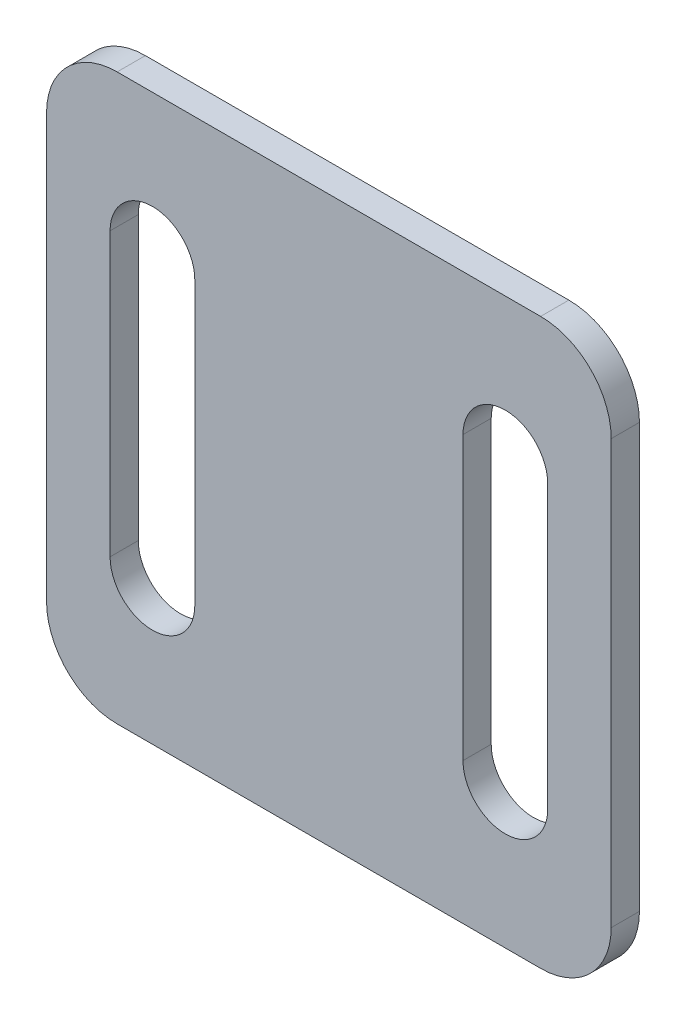
ISO-10303-21;
HEADER;
FILE_DESCRIPTION(('STEP AP214'),'2;1');
FILE_NAME('part.step','',(''),(''),'','','');
FILE_SCHEMA(('AUTOMOTIVE_DESIGN { 1 0 10303 214 1 1 1 1 }'));
ENDSEC;
DATA;
#1=APPLICATION_CONTEXT('core data for automotive mechanical design processes');
#2=APPLICATION_PROTOCOL_DEFINITION('international standard','automotive_design',2000,#1);
#3=PRODUCT_CONTEXT('',#1,'mechanical');
#4=PRODUCT('Part','Part','',(#3));
#5=PRODUCT_RELATED_PRODUCT_CATEGORY('part','',(#4));
#6=PRODUCT_DEFINITION_FORMATION('','',#4);
#7=PRODUCT_DEFINITION_CONTEXT('part definition',#1,'design');
#8=PRODUCT_DEFINITION('design','',#6,#7);
#9=PRODUCT_DEFINITION_SHAPE('','',#8);
#10=(LENGTH_UNIT() NAMED_UNIT(*) SI_UNIT(.MILLI.,.METRE.));
#11=(NAMED_UNIT(*) PLANE_ANGLE_UNIT() SI_UNIT($,.RADIAN.));
#12=(NAMED_UNIT(*) SI_UNIT($,.STERADIAN.) SOLID_ANGLE_UNIT());
#13=UNCERTAINTY_MEASURE_WITH_UNIT(LENGTH_MEASURE(1.E-05),#10,'distance_accuracy_value','');
#14=(GEOMETRIC_REPRESENTATION_CONTEXT(3) GLOBAL_UNCERTAINTY_ASSIGNED_CONTEXT((#13)) GLOBAL_UNIT_ASSIGNED_CONTEXT((#10,
#11,#12)) REPRESENTATION_CONTEXT('',''));
#15=CARTESIAN_POINT('',(0.,0.,0.));
#16=DIRECTION('',(0.,0.,1.));
#17=DIRECTION('',(1.,0.,0.));
#18=AXIS2_PLACEMENT_3D('',#15,#16,#17);
#19=CARTESIAN_POINT('',(0.,0.,4.));
#20=DIRECTION('',(0.,0.,-1.));
#21=DIRECTION('',(-1.,0.,0.));
#22=AXIS2_PLACEMENT_3D('',#19,#20,#21);
#23=PLANE('',#22);
#24=CARTESIAN_POINT('',(25.,-20.,4.));
#25=DIRECTION('',(0.,0.,1.));
#26=DIRECTION('',(1.,0.,0.));
#27=AXIS2_PLACEMENT_3D('',#24,#25,#26);
#28=CIRCLE('',#27,6.);
#29=CARTESIAN_POINT('',(19.,-20.,4.));
#30=VERTEX_POINT('',#29);
#31=CARTESIAN_POINT('',(31.,-20.,4.));
#32=VERTEX_POINT('',#31);
#33=EDGE_CURVE('E197',#30,#32,#28,.T.);
#34=ORIENTED_EDGE('',*,*,#33,.F.);
#35=DIRECTION('',(0.,-1.,0.));
#36=VECTOR('',#35,1.);
#37=CARTESIAN_POINT('',(19.,-20.,4.));
#38=LINE('',#37,#36);
#39=CARTESIAN_POINT('',(19.,20.,4.));
#40=VERTEX_POINT('',#39);
#41=EDGE_CURVE('E205',#40,#30,#38,.T.);
#42=ORIENTED_EDGE('',*,*,#41,.F.);
#43=CARTESIAN_POINT('',(25.,20.,4.));
#44=DIRECTION('',(0.,0.,1.));
#45=DIRECTION('',(1.,0.,0.));
#46=AXIS2_PLACEMENT_3D('',#43,#44,#45);
#47=CIRCLE('',#46,6.);
#48=CARTESIAN_POINT('',(31.,20.,4.));
#49=VERTEX_POINT('',#48);
#50=EDGE_CURVE('E202',#49,#40,#47,.T.);
#51=ORIENTED_EDGE('',*,*,#50,.F.);
#52=DIRECTION('',(0.,1.,0.));
#53=VECTOR('',#52,1.);
#54=CARTESIAN_POINT('',(31.,-20.,4.));
#55=LINE('',#54,#53);
#56=EDGE_CURVE('E199',#32,#49,#55,.T.);
#57=ORIENTED_EDGE('',*,*,#56,.F.);
#58=EDGE_LOOP('',(#34,#42,#51,#57));
#59=FACE_BOUND('',#58,.T.);
#60=DIRECTION('',(0.,1.,0.));
#61=VECTOR('',#60,1.);
#62=CARTESIAN_POINT('',(40.,-40.,4.));
#63=LINE('',#62,#61);
#64=CARTESIAN_POINT('',(40.,-30.,4.));
#65=VERTEX_POINT('',#64);
#66=CARTESIAN_POINT('',(40.,30.,4.));
#67=VERTEX_POINT('',#66);
#68=EDGE_CURVE('E228',#65,#67,#63,.T.);
#69=ORIENTED_EDGE('',*,*,#68,.T.);
#70=CARTESIAN_POINT('',(30.,30.,4.));
#71=DIRECTION('',(0.,0.,-1.));
#72=DIRECTION('',(-1.,0.,0.));
#73=AXIS2_PLACEMENT_3D('',#70,#71,#72);
#74=CIRCLE('',#73,10.);
#75=CARTESIAN_POINT('',(30.,40.,4.));
#76=VERTEX_POINT('',#75);
#77=EDGE_CURVE('E271',#67,#76,#74,.F.);
#78=ORIENTED_EDGE('',*,*,#77,.T.);
#79=DIRECTION('',(-1.,0.,0.));
#80=VECTOR('',#79,1.);
#81=CARTESIAN_POINT('',(-40.,40.,4.));
#82=LINE('',#81,#80);
#83=CARTESIAN_POINT('',(-30.,40.,4.));
#84=VERTEX_POINT('',#83);
#85=EDGE_CURVE('E231',#76,#84,#82,.T.);
#86=ORIENTED_EDGE('',*,*,#85,.T.);
#87=CARTESIAN_POINT('',(-30.,30.,4.));
#88=DIRECTION('',(0.,0.,-1.));
#89=DIRECTION('',(-1.,0.,0.));
#90=AXIS2_PLACEMENT_3D('',#87,#88,#89);
#91=CIRCLE('',#90,10.);
#92=CARTESIAN_POINT('',(-40.,30.,4.));
#93=VERTEX_POINT('',#92);
#94=EDGE_CURVE('E266',#84,#93,#91,.F.);
#95=ORIENTED_EDGE('',*,*,#94,.T.);
#96=DIRECTION('',(0.,-1.,0.));
#97=VECTOR('',#96,1.);
#98=CARTESIAN_POINT('',(-40.,-40.,4.));
#99=LINE('',#98,#97);
#100=CARTESIAN_POINT('',(-40.,-30.,4.));
#101=VERTEX_POINT('',#100);
#102=EDGE_CURVE('E235',#93,#101,#99,.T.);
#103=ORIENTED_EDGE('',*,*,#102,.T.);
#104=CARTESIAN_POINT('',(-30.,-30.,4.));
#105=DIRECTION('',(0.,0.,-1.));
#106=DIRECTION('',(-1.,0.,0.));
#107=AXIS2_PLACEMENT_3D('',#104,#105,#106);
#108=CIRCLE('',#107,10.);
#109=CARTESIAN_POINT('',(-30.,-40.,4.));
#110=VERTEX_POINT('',#109);
#111=EDGE_CURVE('E63',#101,#110,#108,.F.);
#112=ORIENTED_EDGE('',*,*,#111,.T.);
#113=DIRECTION('',(1.,0.,0.));
#114=VECTOR('',#113,1.);
#115=CARTESIAN_POINT('',(-40.,-40.,4.));
#116=LINE('',#115,#114);
#117=CARTESIAN_POINT('',(30.,-40.,4.));
#118=VERTEX_POINT('',#117);
#119=EDGE_CURVE('E237',#110,#118,#116,.T.);
#120=ORIENTED_EDGE('',*,*,#119,.T.);
#121=CARTESIAN_POINT('',(30.,-30.,4.));
#122=DIRECTION('',(0.,0.,-1.));
#123=DIRECTION('',(-1.,0.,0.));
#124=AXIS2_PLACEMENT_3D('',#121,#122,#123);
#125=CIRCLE('',#124,10.);
#126=EDGE_CURVE('E269',#118,#65,#125,.F.);
#127=ORIENTED_EDGE('',*,*,#126,.T.);
#128=EDGE_LOOP('',(#69,#78,#86,#95,#103,#112,#120,#127));
#129=FACE_BOUND('',#128,.T.);
#130=CARTESIAN_POINT('',(-25.,-20.,4.));
#131=DIRECTION('',(0.,0.,1.));
#132=DIRECTION('',(1.,0.,0.));
#133=AXIS2_PLACEMENT_3D('',#130,#131,#132);
#134=CIRCLE('',#133,6.);
#135=CARTESIAN_POINT('',(-31.,-20.,4.));
#136=VERTEX_POINT('',#135);
#137=CARTESIAN_POINT('',(-19.,-20.,4.));
#138=VERTEX_POINT('',#137);
#139=EDGE_CURVE('E156',#136,#138,#134,.T.);
#140=ORIENTED_EDGE('',*,*,#139,.F.);
#141=DIRECTION('',(0.,-1.,0.));
#142=VECTOR('',#141,1.);
#143=CARTESIAN_POINT('',(-31.,-20.,4.));
#144=LINE('',#143,#142);
#145=CARTESIAN_POINT('',(-31.,20.,4.));
#146=VERTEX_POINT('',#145);
#147=EDGE_CURVE('E181',#146,#136,#144,.T.);
#148=ORIENTED_EDGE('',*,*,#147,.F.);
#149=CARTESIAN_POINT('',(-25.,20.,4.));
#150=DIRECTION('',(0.,0.,1.));
#151=DIRECTION('',(1.,0.,0.));
#152=AXIS2_PLACEMENT_3D('',#149,#150,#151);
#153=CIRCLE('',#152,6.);
#154=CARTESIAN_POINT('',(-19.,20.,4.));
#155=VERTEX_POINT('',#154);
#156=EDGE_CURVE('E179',#155,#146,#153,.T.);
#157=ORIENTED_EDGE('',*,*,#156,.F.);
#158=DIRECTION('',(0.,1.,0.));
#159=VECTOR('',#158,1.);
#160=CARTESIAN_POINT('',(-19.,-20.,4.));
#161=LINE('',#160,#159);
#162=EDGE_CURVE('E166',#138,#155,#161,.T.);
#163=ORIENTED_EDGE('',*,*,#162,.F.);
#164=EDGE_LOOP('',(#140,#148,#157,#163));
#165=FACE_BOUND('',#164,.T.);
#166=ADVANCED_FACE('F41',(#59,#129,#165),#23,.F.);
#167=CARTESIAN_POINT('',(0.,0.,0.));
#168=DIRECTION('',(0.,0.,-1.));
#169=DIRECTION('',(-1.,0.,0.));
#170=AXIS2_PLACEMENT_3D('',#167,#168,#169);
#171=PLANE('',#170);
#172=DIRECTION('',(-1.,0.,0.));
#173=VECTOR('',#172,1.);
#174=CARTESIAN_POINT('',(-40.,40.,0.));
#175=LINE('',#174,#173);
#176=CARTESIAN_POINT('',(30.,40.,0.));
#177=VERTEX_POINT('',#176);
#178=CARTESIAN_POINT('',(-30.,40.,0.));
#179=VERTEX_POINT('',#178);
#180=EDGE_CURVE('E242',#177,#179,#175,.T.);
#181=ORIENTED_EDGE('',*,*,#180,.F.);
#182=CARTESIAN_POINT('',(30.,30.,0.));
#183=DIRECTION('',(0.,0.,-1.));
#184=DIRECTION('',(-1.,0.,0.));
#185=AXIS2_PLACEMENT_3D('',#182,#183,#184);
#186=CIRCLE('',#185,10.);
#187=CARTESIAN_POINT('',(40.,30.,0.));
#188=VERTEX_POINT('',#187);
#189=EDGE_CURVE('E259',#177,#188,#186,.T.);
#190=ORIENTED_EDGE('',*,*,#189,.T.);
#191=DIRECTION('',(0.,1.,0.));
#192=VECTOR('',#191,1.);
#193=CARTESIAN_POINT('',(40.,-40.,0.));
#194=LINE('',#193,#192);
#195=CARTESIAN_POINT('',(40.,-30.,0.));
#196=VERTEX_POINT('',#195);
#197=EDGE_CURVE('E227',#196,#188,#194,.T.);
#198=ORIENTED_EDGE('',*,*,#197,.F.);
#199=CARTESIAN_POINT('',(30.,-30.,0.));
#200=DIRECTION('',(0.,0.,-1.));
#201=DIRECTION('',(-1.,0.,0.));
#202=AXIS2_PLACEMENT_3D('',#199,#200,#201);
#203=CIRCLE('',#202,10.);
#204=CARTESIAN_POINT('',(30.,-40.,0.));
#205=VERTEX_POINT('',#204);
#206=EDGE_CURVE('E257',#196,#205,#203,.T.);
#207=ORIENTED_EDGE('',*,*,#206,.T.);
#208=DIRECTION('',(1.,0.,0.));
#209=VECTOR('',#208,1.);
#210=CARTESIAN_POINT('',(-40.,-40.,0.));
#211=LINE('',#210,#209);
#212=CARTESIAN_POINT('',(-30.,-40.,0.));
#213=VERTEX_POINT('',#212);
#214=EDGE_CURVE('E232',#213,#205,#211,.T.);
#215=ORIENTED_EDGE('',*,*,#214,.F.);
#216=CARTESIAN_POINT('',(-30.,-30.,0.));
#217=DIRECTION('',(0.,0.,-1.));
#218=DIRECTION('',(-1.,0.,0.));
#219=AXIS2_PLACEMENT_3D('',#216,#217,#218);
#220=CIRCLE('',#219,10.);
#221=CARTESIAN_POINT('',(-40.,-30.,0.));
#222=VERTEX_POINT('',#221);
#223=EDGE_CURVE('E255',#213,#222,#220,.T.);
#224=ORIENTED_EDGE('',*,*,#223,.T.);
#225=DIRECTION('',(0.,-1.,0.));
#226=VECTOR('',#225,1.);
#227=CARTESIAN_POINT('',(-40.,-40.,0.));
#228=LINE('',#227,#226);
#229=CARTESIAN_POINT('',(-40.,30.,0.));
#230=VERTEX_POINT('',#229);
#231=EDGE_CURVE('E245',#230,#222,#228,.T.);
#232=ORIENTED_EDGE('',*,*,#231,.F.);
#233=CARTESIAN_POINT('',(-30.,30.,0.));
#234=DIRECTION('',(0.,0.,-1.));
#235=DIRECTION('',(-1.,0.,0.));
#236=AXIS2_PLACEMENT_3D('',#233,#234,#235);
#237=CIRCLE('',#236,10.);
#238=EDGE_CURVE('E253',#230,#179,#237,.T.);
#239=ORIENTED_EDGE('',*,*,#238,.T.);
#240=EDGE_LOOP('',(#181,#190,#198,#207,#215,#224,#232,#239));
#241=FACE_BOUND('',#240,.T.);
#242=DIRECTION('',(0.,-1.,0.));
#243=VECTOR('',#242,1.);
#244=CARTESIAN_POINT('',(19.,-20.,0.));
#245=LINE('',#244,#243);
#246=CARTESIAN_POINT('',(19.,20.,0.));
#247=VERTEX_POINT('',#246);
#248=CARTESIAN_POINT('',(19.,-20.,0.));
#249=VERTEX_POINT('',#248);
#250=EDGE_CURVE('E200',#247,#249,#245,.T.);
#251=ORIENTED_EDGE('',*,*,#250,.T.);
#252=CARTESIAN_POINT('',(25.,-20.,0.));
#253=DIRECTION('',(0.,0.,1.));
#254=DIRECTION('',(1.,0.,0.));
#255=AXIS2_PLACEMENT_3D('',#252,#253,#254);
#256=CIRCLE('',#255,6.);
#257=CARTESIAN_POINT('',(31.,-20.,0.));
#258=VERTEX_POINT('',#257);
#259=EDGE_CURVE('E174',#249,#258,#256,.T.);
#260=ORIENTED_EDGE('',*,*,#259,.T.);
#261=DIRECTION('',(0.,1.,0.));
#262=VECTOR('',#261,1.);
#263=CARTESIAN_POINT('',(31.,-20.,0.));
#264=LINE('',#263,#262);
#265=CARTESIAN_POINT('',(31.,20.,0.));
#266=VERTEX_POINT('',#265);
#267=EDGE_CURVE('E210',#258,#266,#264,.T.);
#268=ORIENTED_EDGE('',*,*,#267,.T.);
#269=CARTESIAN_POINT('',(25.,20.,0.));
#270=DIRECTION('',(0.,0.,1.));
#271=DIRECTION('',(1.,0.,0.));
#272=AXIS2_PLACEMENT_3D('',#269,#270,#271);
#273=CIRCLE('',#272,6.);
#274=EDGE_CURVE('E213',#266,#247,#273,.T.);
#275=ORIENTED_EDGE('',*,*,#274,.T.);
#276=EDGE_LOOP('',(#251,#260,#268,#275));
#277=FACE_BOUND('',#276,.T.);
#278=DIRECTION('',(0.,-1.,0.));
#279=VECTOR('',#278,1.);
#280=CARTESIAN_POINT('',(-31.,-20.,0.));
#281=LINE('',#280,#279);
#282=CARTESIAN_POINT('',(-31.,20.,0.));
#283=VERTEX_POINT('',#282);
#284=CARTESIAN_POINT('',(-31.,-20.,0.));
#285=VERTEX_POINT('',#284);
#286=EDGE_CURVE('E167',#283,#285,#281,.T.);
#287=ORIENTED_EDGE('',*,*,#286,.T.);
#288=CARTESIAN_POINT('',(-25.,-20.,0.));
#289=DIRECTION('',(0.,0.,1.));
#290=DIRECTION('',(1.,0.,0.));
#291=AXIS2_PLACEMENT_3D('',#288,#289,#290);
#292=CIRCLE('',#291,6.);
#293=CARTESIAN_POINT('',(-19.,-20.,0.));
#294=VERTEX_POINT('',#293);
#295=EDGE_CURVE('E185',#285,#294,#292,.T.);
#296=ORIENTED_EDGE('',*,*,#295,.T.);
#297=DIRECTION('',(0.,1.,0.));
#298=VECTOR('',#297,1.);
#299=CARTESIAN_POINT('',(-19.,-20.,0.));
#300=LINE('',#299,#298);
#301=CARTESIAN_POINT('',(-19.,20.,0.));
#302=VERTEX_POINT('',#301);
#303=EDGE_CURVE('E173',#294,#302,#300,.T.);
#304=ORIENTED_EDGE('',*,*,#303,.T.);
#305=CARTESIAN_POINT('',(-25.,20.,0.));
#306=DIRECTION('',(0.,0.,1.));
#307=DIRECTION('',(1.,0.,0.));
#308=AXIS2_PLACEMENT_3D('',#305,#306,#307);
#309=CIRCLE('',#308,6.);
#310=EDGE_CURVE('E188',#302,#283,#309,.T.);
#311=ORIENTED_EDGE('',*,*,#310,.T.);
#312=EDGE_LOOP('',(#287,#296,#304,#311));
#313=FACE_BOUND('',#312,.T.);
#314=ADVANCED_FACE('F287',(#241,#277,#313),#171,.T.);
#315=CARTESIAN_POINT('',(40.,-40.,4.));
#316=DIRECTION('',(-1.,0.,0.));
#317=DIRECTION('',(0.,-1.,0.));
#318=AXIS2_PLACEMENT_3D('',#315,#316,#317);
#319=PLANE('',#318);
#320=ORIENTED_EDGE('',*,*,#197,.T.);
#321=DIRECTION('',(0.,0.,-1.));
#322=VECTOR('',#321,1.);
#323=CARTESIAN_POINT('',(40.,30.,4.));
#324=LINE('',#323,#322);
#325=EDGE_CURVE('E264',#188,#67,#324,.F.);
#326=ORIENTED_EDGE('',*,*,#325,.T.);
#327=ORIENTED_EDGE('',*,*,#68,.F.);
#328=DIRECTION('',(0.,0.,-1.));
#329=VECTOR('',#328,1.);
#330=CARTESIAN_POINT('',(40.,-30.,4.));
#331=LINE('',#330,#329);
#332=EDGE_CURVE('E261',#65,#196,#331,.T.);
#333=ORIENTED_EDGE('',*,*,#332,.T.);
#334=EDGE_LOOP('',(#320,#326,#327,#333));
#335=FACE_BOUND('',#334,.T.);
#336=ADVANCED_FACE('F301',(#335),#319,.F.);
#337=CARTESIAN_POINT('',(-40.,40.,4.));
#338=DIRECTION('',(0.,-1.,0.));
#339=DIRECTION('',(1.,0.,0.));
#340=AXIS2_PLACEMENT_3D('',#337,#338,#339);
#341=PLANE('',#340);
#342=ORIENTED_EDGE('',*,*,#85,.F.);
#343=DIRECTION('',(0.,0.,-1.));
#344=VECTOR('',#343,1.);
#345=CARTESIAN_POINT('',(30.,40.,4.));
#346=LINE('',#345,#344);
#347=EDGE_CURVE('E250',#76,#177,#346,.T.);
#348=ORIENTED_EDGE('',*,*,#347,.T.);
#349=ORIENTED_EDGE('',*,*,#180,.T.);
#350=DIRECTION('',(0.,0.,-1.));
#351=VECTOR('',#350,1.);
#352=CARTESIAN_POINT('',(-30.,40.,4.));
#353=LINE('',#352,#351);
#354=EDGE_CURVE('E239',#179,#84,#353,.F.);
#355=ORIENTED_EDGE('',*,*,#354,.T.);
#356=EDGE_LOOP('',(#342,#348,#349,#355));
#357=FACE_BOUND('',#356,.T.);
#358=ADVANCED_FACE('F309',(#357),#341,.F.);
#359=CARTESIAN_POINT('',(-40.,-40.,4.));
#360=DIRECTION('',(1.,0.,0.));
#361=DIRECTION('',(0.,0.,-1.));
#362=AXIS2_PLACEMENT_3D('',#359,#360,#361);
#363=PLANE('',#362);
#364=ORIENTED_EDGE('',*,*,#231,.T.);
#365=DIRECTION('',(0.,0.,-1.));
#366=VECTOR('',#365,1.);
#367=CARTESIAN_POINT('',(-40.,-30.,4.));
#368=LINE('',#367,#366);
#369=EDGE_CURVE('E11',#222,#101,#368,.F.);
#370=ORIENTED_EDGE('',*,*,#369,.T.);
#371=ORIENTED_EDGE('',*,*,#102,.F.);
#372=DIRECTION('',(0.,0.,-1.));
#373=VECTOR('',#372,1.);
#374=CARTESIAN_POINT('',(-40.,30.,4.));
#375=LINE('',#374,#373);
#376=EDGE_CURVE('E49',#93,#230,#375,.T.);
#377=ORIENTED_EDGE('',*,*,#376,.T.);
#378=EDGE_LOOP('',(#364,#370,#371,#377));
#379=FACE_BOUND('',#378,.T.);
#380=ADVANCED_FACE('F281',(#379),#363,.F.);
#381=CARTESIAN_POINT('',(-40.,-40.,4.));
#382=DIRECTION('',(0.,1.,0.));
#383=DIRECTION('',(0.,0.,1.));
#384=AXIS2_PLACEMENT_3D('',#381,#382,#383);
#385=PLANE('',#384);
#386=ORIENTED_EDGE('',*,*,#214,.T.);
#387=DIRECTION('',(0.,0.,-1.));
#388=VECTOR('',#387,1.);
#389=CARTESIAN_POINT('',(30.,-40.,4.));
#390=LINE('',#389,#388);
#391=EDGE_CURVE('E56',#205,#118,#390,.F.);
#392=ORIENTED_EDGE('',*,*,#391,.T.);
#393=ORIENTED_EDGE('',*,*,#119,.F.);
#394=DIRECTION('',(0.,0.,-1.));
#395=VECTOR('',#394,1.);
#396=CARTESIAN_POINT('',(-30.,-40.,4.));
#397=LINE('',#396,#395);
#398=EDGE_CURVE('E273',#110,#213,#397,.T.);
#399=ORIENTED_EDGE('',*,*,#398,.T.);
#400=EDGE_LOOP('',(#386,#392,#393,#399));
#401=FACE_BOUND('',#400,.T.);
#402=ADVANCED_FACE('F293',(#401),#385,.F.);
#403=CARTESIAN_POINT('',(25.,-20.,4.));
#404=DIRECTION('',(0.,0.,-1.));
#405=DIRECTION('',(-1.,0.,0.));
#406=AXIS2_PLACEMENT_3D('',#403,#404,#405);
#407=CYLINDRICAL_SURFACE('',#406,6.);
#408=ORIENTED_EDGE('',*,*,#259,.F.);
#409=DIRECTION('',(0.,0.,-1.));
#410=VECTOR('',#409,1.);
#411=CARTESIAN_POINT('',(19.,-20.,4.));
#412=LINE('',#411,#410);
#413=EDGE_CURVE('E207',#30,#249,#412,.T.);
#414=ORIENTED_EDGE('',*,*,#413,.F.);
#415=ORIENTED_EDGE('',*,*,#33,.T.);
#416=DIRECTION('',(0.,0.,-1.));
#417=VECTOR('',#416,1.);
#418=CARTESIAN_POINT('',(31.,-20.,4.));
#419=LINE('',#418,#417);
#420=EDGE_CURVE('E224',#32,#258,#419,.T.);
#421=ORIENTED_EDGE('',*,*,#420,.T.);
#422=EDGE_LOOP('',(#408,#414,#415,#421));
#423=FACE_BOUND('',#422,.T.);
#424=ADVANCED_FACE('F325',(#423),#407,.F.);
#425=CARTESIAN_POINT('',(31.,-20.,4.));
#426=DIRECTION('',(-1.,0.,0.));
#427=DIRECTION('',(0.,-1.,0.));
#428=AXIS2_PLACEMENT_3D('',#425,#426,#427);
#429=PLANE('',#428);
#430=ORIENTED_EDGE('',*,*,#267,.F.);
#431=ORIENTED_EDGE('',*,*,#420,.F.);
#432=ORIENTED_EDGE('',*,*,#56,.T.);
#433=DIRECTION('',(0.,0.,-1.));
#434=VECTOR('',#433,1.);
#435=CARTESIAN_POINT('',(31.,20.,4.));
#436=LINE('',#435,#434);
#437=EDGE_CURVE('E222',#49,#266,#436,.T.);
#438=ORIENTED_EDGE('',*,*,#437,.T.);
#439=EDGE_LOOP('',(#430,#431,#432,#438));
#440=FACE_BOUND('',#439,.T.);
#441=ADVANCED_FACE('F407',(#440),#429,.T.);
#442=CARTESIAN_POINT('',(25.,20.,4.));
#443=DIRECTION('',(0.,0.,-1.));
#444=DIRECTION('',(-1.,0.,0.));
#445=AXIS2_PLACEMENT_3D('',#442,#443,#444);
#446=CYLINDRICAL_SURFACE('',#445,6.);
#447=ORIENTED_EDGE('',*,*,#274,.F.);
#448=ORIENTED_EDGE('',*,*,#437,.F.);
#449=ORIENTED_EDGE('',*,*,#50,.T.);
#450=DIRECTION('',(0.,0.,-1.));
#451=VECTOR('',#450,1.);
#452=CARTESIAN_POINT('',(19.,20.,4.));
#453=LINE('',#452,#451);
#454=EDGE_CURVE('E220',#40,#247,#453,.T.);
#455=ORIENTED_EDGE('',*,*,#454,.T.);
#456=EDGE_LOOP('',(#447,#448,#449,#455));
#457=FACE_BOUND('',#456,.T.);
#458=ADVANCED_FACE('F398',(#457),#446,.F.);
#459=CARTESIAN_POINT('',(19.,-20.,4.));
#460=DIRECTION('',(1.,0.,0.));
#461=DIRECTION('',(0.,1.,0.));
#462=AXIS2_PLACEMENT_3D('',#459,#460,#461);
#463=PLANE('',#462);
#464=ORIENTED_EDGE('',*,*,#250,.F.);
#465=ORIENTED_EDGE('',*,*,#454,.F.);
#466=ORIENTED_EDGE('',*,*,#41,.T.);
#467=ORIENTED_EDGE('',*,*,#413,.T.);
#468=EDGE_LOOP('',(#464,#465,#466,#467));
#469=FACE_BOUND('',#468,.T.);
#470=ADVANCED_FACE('F390',(#469),#463,.T.);
#471=CARTESIAN_POINT('',(-25.,-20.,4.));
#472=DIRECTION('',(0.,0.,-1.));
#473=DIRECTION('',(-1.,0.,0.));
#474=AXIS2_PLACEMENT_3D('',#471,#472,#473);
#475=CYLINDRICAL_SURFACE('',#474,6.);
#476=ORIENTED_EDGE('',*,*,#295,.F.);
#477=DIRECTION('',(0.,0.,-1.));
#478=VECTOR('',#477,1.);
#479=CARTESIAN_POINT('',(-31.,-20.,4.));
#480=LINE('',#479,#478);
#481=EDGE_CURVE('E162',#136,#285,#480,.T.);
#482=ORIENTED_EDGE('',*,*,#481,.F.);
#483=ORIENTED_EDGE('',*,*,#139,.T.);
#484=DIRECTION('',(0.,0.,-1.));
#485=VECTOR('',#484,1.);
#486=CARTESIAN_POINT('',(-19.,-20.,4.));
#487=LINE('',#486,#485);
#488=EDGE_CURVE('E159',#138,#294,#487,.T.);
#489=ORIENTED_EDGE('',*,*,#488,.T.);
#490=EDGE_LOOP('',(#476,#482,#483,#489));
#491=FACE_BOUND('',#490,.T.);
#492=ADVANCED_FACE('F158',(#491),#475,.F.);
#493=CARTESIAN_POINT('',(-19.,-20.,4.));
#494=DIRECTION('',(-1.,0.,0.));
#495=DIRECTION('',(0.,-1.,0.));
#496=AXIS2_PLACEMENT_3D('',#493,#494,#495);
#497=PLANE('',#496);
#498=ORIENTED_EDGE('',*,*,#303,.F.);
#499=ORIENTED_EDGE('',*,*,#488,.F.);
#500=ORIENTED_EDGE('',*,*,#162,.T.);
#501=DIRECTION('',(0.,0.,-1.));
#502=VECTOR('',#501,1.);
#503=CARTESIAN_POINT('',(-19.,20.,4.));
#504=LINE('',#503,#502);
#505=EDGE_CURVE('E175',#155,#302,#504,.T.);
#506=ORIENTED_EDGE('',*,*,#505,.T.);
#507=EDGE_LOOP('',(#498,#499,#500,#506));
#508=FACE_BOUND('',#507,.T.);
#509=ADVANCED_FACE('F170',(#508),#497,.T.);
#510=CARTESIAN_POINT('',(-25.,20.,4.));
#511=DIRECTION('',(0.,0.,-1.));
#512=DIRECTION('',(-1.,0.,0.));
#513=AXIS2_PLACEMENT_3D('',#510,#511,#512);
#514=CYLINDRICAL_SURFACE('',#513,6.);
#515=ORIENTED_EDGE('',*,*,#310,.F.);
#516=ORIENTED_EDGE('',*,*,#505,.F.);
#517=ORIENTED_EDGE('',*,*,#156,.T.);
#518=DIRECTION('',(0.,0.,-1.));
#519=VECTOR('',#518,1.);
#520=CARTESIAN_POINT('',(-31.,20.,4.));
#521=LINE('',#520,#519);
#522=EDGE_CURVE('E194',#146,#283,#521,.T.);
#523=ORIENTED_EDGE('',*,*,#522,.T.);
#524=EDGE_LOOP('',(#515,#516,#517,#523));
#525=FACE_BOUND('',#524,.T.);
#526=ADVANCED_FACE('F366',(#525),#514,.F.);
#527=CARTESIAN_POINT('',(-31.,-20.,4.));
#528=DIRECTION('',(1.,0.,0.));
#529=DIRECTION('',(0.,1.,0.));
#530=AXIS2_PLACEMENT_3D('',#527,#528,#529);
#531=PLANE('',#530);
#532=ORIENTED_EDGE('',*,*,#286,.F.);
#533=ORIENTED_EDGE('',*,*,#522,.F.);
#534=ORIENTED_EDGE('',*,*,#147,.T.);
#535=ORIENTED_EDGE('',*,*,#481,.T.);
#536=EDGE_LOOP('',(#532,#533,#534,#535));
#537=FACE_BOUND('',#536,.T.);
#538=ADVANCED_FACE('F338',(#537),#531,.T.);
#539=CARTESIAN_POINT('',(30.,30.,4.));
#540=DIRECTION('',(0.,0.,-1.));
#541=DIRECTION('',(-1.,0.,0.));
#542=AXIS2_PLACEMENT_3D('',#539,#540,#541);
#543=CYLINDRICAL_SURFACE('',#542,10.);
#544=ORIENTED_EDGE('',*,*,#77,.F.);
#545=ORIENTED_EDGE('',*,*,#325,.F.);
#546=ORIENTED_EDGE('',*,*,#189,.F.);
#547=ORIENTED_EDGE('',*,*,#347,.F.);
#548=EDGE_LOOP('',(#544,#545,#546,#547));
#549=FACE_BOUND('',#548,.T.);
#550=ADVANCED_FACE('F306',(#549),#543,.T.);
#551=CARTESIAN_POINT('',(30.,-30.,4.));
#552=DIRECTION('',(0.,0.,-1.));
#553=DIRECTION('',(-1.,0.,0.));
#554=AXIS2_PLACEMENT_3D('',#551,#552,#553);
#555=CYLINDRICAL_SURFACE('',#554,10.);
#556=ORIENTED_EDGE('',*,*,#126,.F.);
#557=ORIENTED_EDGE('',*,*,#391,.F.);
#558=ORIENTED_EDGE('',*,*,#206,.F.);
#559=ORIENTED_EDGE('',*,*,#332,.F.);
#560=EDGE_LOOP('',(#556,#557,#558,#559));
#561=FACE_BOUND('',#560,.T.);
#562=ADVANCED_FACE('F298',(#561),#555,.T.);
#563=CARTESIAN_POINT('',(-30.,-30.,4.));
#564=DIRECTION('',(0.,0.,-1.));
#565=DIRECTION('',(-1.,0.,0.));
#566=AXIS2_PLACEMENT_3D('',#563,#564,#565);
#567=CYLINDRICAL_SURFACE('',#566,10.);
#568=ORIENTED_EDGE('',*,*,#111,.F.);
#569=ORIENTED_EDGE('',*,*,#369,.F.);
#570=ORIENTED_EDGE('',*,*,#223,.F.);
#571=ORIENTED_EDGE('',*,*,#398,.F.);
#572=EDGE_LOOP('',(#568,#569,#570,#571));
#573=FACE_BOUND('',#572,.T.);
#574=ADVANCED_FACE('F292',(#573),#567,.T.);
#575=CARTESIAN_POINT('',(-30.,30.,4.));
#576=DIRECTION('',(0.,0.,-1.));
#577=DIRECTION('',(-1.,0.,0.));
#578=AXIS2_PLACEMENT_3D('',#575,#576,#577);
#579=CYLINDRICAL_SURFACE('',#578,10.);
#580=ORIENTED_EDGE('',*,*,#94,.F.);
#581=ORIENTED_EDGE('',*,*,#354,.F.);
#582=ORIENTED_EDGE('',*,*,#238,.F.);
#583=ORIENTED_EDGE('',*,*,#376,.F.);
#584=EDGE_LOOP('',(#580,#581,#582,#583));
#585=FACE_BOUND('',#584,.T.);
#586=ADVANCED_FACE('F43',(#585),#579,.T.);
#587=CLOSED_SHELL('',(#166,#314,#336,#358,#380,#402,#424,#441,#458,#470,#492,#509,#526,#538,
#550,#562,#574,#586));
#588=MANIFOLD_SOLID_BREP('B2',#587);
#589=ADVANCED_BREP_SHAPE_REPRESENTATION('',(#18,#588),#14);
#590=SHAPE_DEFINITION_REPRESENTATION(#9,#589);
ENDSEC;
END-ISO-10303-21;
